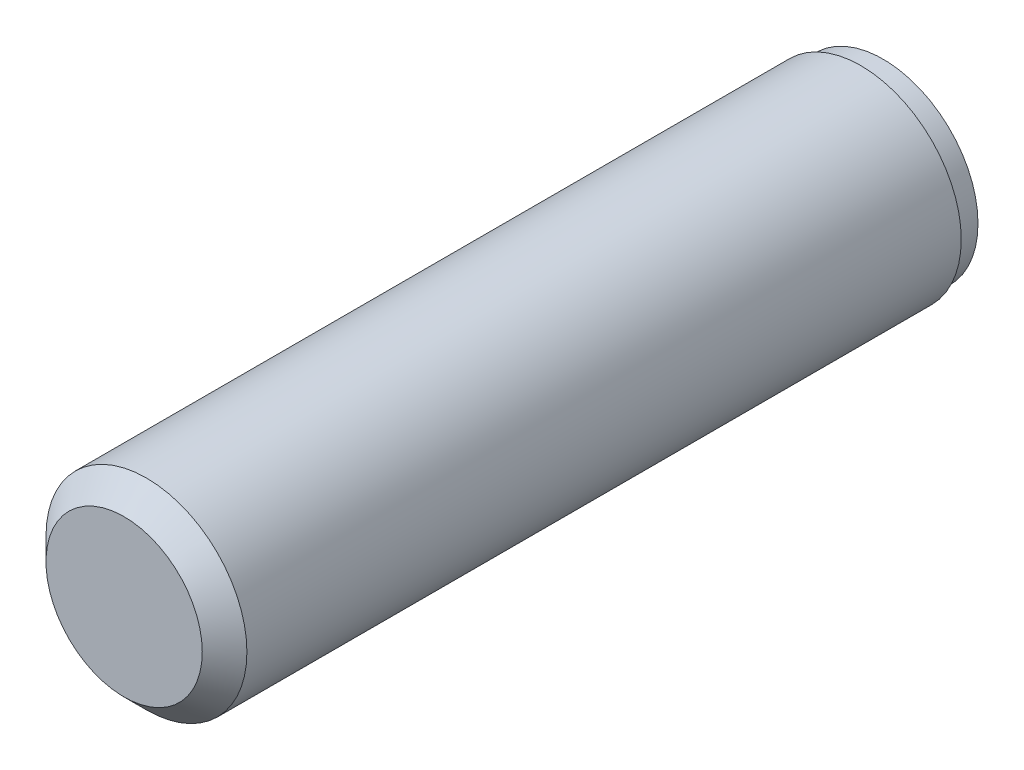
ISO-10303-21;
HEADER;
FILE_DESCRIPTION(('STEP AP214'),'2;1');
FILE_NAME('part.step','',(''),(''),'','','');
FILE_SCHEMA(('AUTOMOTIVE_DESIGN { 1 0 10303 214 1 1 1 1 }'));
ENDSEC;
DATA;
#1=APPLICATION_CONTEXT('core data for automotive mechanical design processes');
#2=APPLICATION_PROTOCOL_DEFINITION('international standard','automotive_design',2000,#1);
#3=PRODUCT_CONTEXT('',#1,'mechanical');
#4=PRODUCT('Part','Part','',(#3));
#5=PRODUCT_RELATED_PRODUCT_CATEGORY('part','',(#4));
#6=PRODUCT_DEFINITION_FORMATION('','',#4);
#7=PRODUCT_DEFINITION_CONTEXT('part definition',#1,'design');
#8=PRODUCT_DEFINITION('design','',#6,#7);
#9=PRODUCT_DEFINITION_SHAPE('','',#8);
#10=(LENGTH_UNIT() NAMED_UNIT(*) SI_UNIT(.MILLI.,.METRE.));
#11=(NAMED_UNIT(*) PLANE_ANGLE_UNIT() SI_UNIT($,.RADIAN.));
#12=(NAMED_UNIT(*) SI_UNIT($,.STERADIAN.) SOLID_ANGLE_UNIT());
#13=UNCERTAINTY_MEASURE_WITH_UNIT(LENGTH_MEASURE(1.E-05),#10,'distance_accuracy_value','');
#14=(GEOMETRIC_REPRESENTATION_CONTEXT(3) GLOBAL_UNCERTAINTY_ASSIGNED_CONTEXT((#13)) GLOBAL_UNIT_ASSIGNED_CONTEXT((#10,
#11,#12)) REPRESENTATION_CONTEXT('',''));
#15=CARTESIAN_POINT('',(0.,0.,0.));
#16=DIRECTION('',(0.,0.,1.));
#17=DIRECTION('',(1.,0.,0.));
#18=AXIS2_PLACEMENT_3D('',#15,#16,#17);
#19=CARTESIAN_POINT('',(0.,0.,66.));
#20=DIRECTION('',(0.,0.,-1.));
#21=DIRECTION('',(-1.,0.,0.));
#22=AXIS2_PLACEMENT_3D('',#19,#20,#21);
#23=CYLINDRICAL_SURFACE('',#22,9.);
#24=CARTESIAN_POINT('',(0.,0.,64.));
#25=DIRECTION('',(0.,0.,1.));
#26=DIRECTION('',(1.,0.,0.));
#27=AXIS2_PLACEMENT_3D('',#24,#25,#26);
#28=CIRCLE('',#27,9.);
#29=CARTESIAN_POINT('',(9.,0.,64.));
#30=VERTEX_POINT('',#29);
#31=EDGE_CURVE('E10',#30,#30,#28,.F.);
#32=ORIENTED_EDGE('',*,*,#31,.T.);
#33=EDGE_LOOP('',(#32));
#34=FACE_BOUND('',#33,.T.);
#35=CARTESIAN_POINT('',(0.,0.,0.));
#36=DIRECTION('',(0.,0.,1.));
#37=DIRECTION('',(1.,0.,0.));
#38=AXIS2_PLACEMENT_3D('',#35,#36,#37);
#39=CIRCLE('',#38,9.);
#40=CARTESIAN_POINT('',(9.,0.,0.));
#41=VERTEX_POINT('',#40);
#42=EDGE_CURVE('E70',#41,#41,#39,.T.);
#43=ORIENTED_EDGE('',*,*,#42,.T.);
#44=EDGE_LOOP('',(#43));
#45=FACE_BOUND('',#44,.T.);
#46=ADVANCED_FACE('F44',(#34,#45),#23,.T.);
#47=CARTESIAN_POINT('',(0.,0.,66.));
#48=DIRECTION('',(0.,0.,1.));
#49=DIRECTION('',(1.,0.,0.));
#50=AXIS2_PLACEMENT_3D('',#47,#48,#49);
#51=PLANE('',#50);
#52=CARTESIAN_POINT('',(0.,0.,66.));
#53=DIRECTION('',(0.,0.,1.));
#54=DIRECTION('',(1.,0.,0.));
#55=AXIS2_PLACEMENT_3D('',#52,#53,#54);
#56=CIRCLE('',#55,6.99999999999999);
#57=CARTESIAN_POINT('',(6.99999999999999,0.,66.));
#58=VERTEX_POINT('',#57);
#59=EDGE_CURVE('E53',#58,#58,#56,.T.);
#60=ORIENTED_EDGE('',*,*,#59,.T.);
#61=EDGE_LOOP('',(#60));
#62=FACE_BOUND('',#61,.T.);
#63=ADVANCED_FACE('F131',(#62),#51,.T.);
#64=CARTESIAN_POINT('',(0.,0.,0.));
#65=DIRECTION('',(0.,0.,1.));
#66=DIRECTION('',(1.,0.,0.));
#67=AXIS2_PLACEMENT_3D('',#64,#65,#66);
#68=PLANE('',#67);
#69=CARTESIAN_POINT('',(0.,0.,0.));
#70=DIRECTION('',(0.,0.,-1.));
#71=DIRECTION('',(-1.,0.,0.));
#72=AXIS2_PLACEMENT_3D('',#69,#70,#71);
#73=CIRCLE('',#72,8.5);
#74=CARTESIAN_POINT('',(-8.5,0.,0.));
#75=VERTEX_POINT('',#74);
#76=EDGE_CURVE('E69',#75,#75,#73,.T.);
#77=ORIENTED_EDGE('',*,*,#76,.F.);
#78=EDGE_LOOP('',(#77));
#79=FACE_BOUND('',#78,.T.);
#80=ORIENTED_EDGE('',*,*,#42,.F.);
#81=EDGE_LOOP('',(#80));
#82=FACE_BOUND('',#81,.T.);
#83=ADVANCED_FACE('F125',(#79,#82),#68,.F.);
#84=CARTESIAN_POINT('',(0.,0.,-2.));
#85=DIRECTION('',(0.,0.,1.));
#86=DIRECTION('',(1.,0.,0.));
#87=AXIS2_PLACEMENT_3D('',#84,#85,#86);
#88=CYLINDRICAL_SURFACE('',#87,8.5);
#89=CARTESIAN_POINT('',(0.,0.,-2.));
#90=DIRECTION('',(0.,0.,-1.));
#91=DIRECTION('',(-1.,0.,0.));
#92=AXIS2_PLACEMENT_3D('',#89,#90,#91);
#93=CIRCLE('',#92,8.5);
#94=CARTESIAN_POINT('',(-8.5,0.,-2.));
#95=VERTEX_POINT('',#94);
#96=EDGE_CURVE('E74',#95,#95,#93,.T.);
#97=ORIENTED_EDGE('',*,*,#96,.F.);
#98=EDGE_LOOP('',(#97));
#99=FACE_BOUND('',#98,.T.);
#100=ORIENTED_EDGE('',*,*,#76,.T.);
#101=EDGE_LOOP('',(#100));
#102=FACE_BOUND('',#101,.T.);
#103=ADVANCED_FACE('F119',(#99,#102),#88,.T.);
#104=CARTESIAN_POINT('',(0.,0.,-2.));
#105=DIRECTION('',(0.,0.,-1.));
#106=DIRECTION('',(-1.,0.,0.));
#107=AXIS2_PLACEMENT_3D('',#104,#105,#106);
#108=PLANE('',#107);
#109=CARTESIAN_POINT('',(0.,0.,-2.));
#110=DIRECTION('',(0.,0.,-1.));
#111=DIRECTION('',(-1.,0.,0.));
#112=AXIS2_PLACEMENT_3D('',#109,#110,#111);
#113=CIRCLE('',#112,8.);
#114=CARTESIAN_POINT('',(-8.,0.,-2.));
#115=VERTEX_POINT('',#114);
#116=EDGE_CURVE('E82',#115,#115,#113,.T.);
#117=ORIENTED_EDGE('',*,*,#116,.F.);
#118=EDGE_LOOP('',(#117));
#119=FACE_BOUND('',#118,.T.);
#120=ORIENTED_EDGE('',*,*,#96,.T.);
#121=EDGE_LOOP('',(#120));
#122=FACE_BOUND('',#121,.T.);
#123=ADVANCED_FACE('F113',(#119,#122),#108,.T.);
#124=CARTESIAN_POINT('',(0.,0.,-0.5));
#125=DIRECTION('',(0.,0.,-1.));
#126=DIRECTION('',(-1.,0.,0.));
#127=AXIS2_PLACEMENT_3D('',#124,#125,#126);
#128=CYLINDRICAL_SURFACE('',#127,8.);
#129=CARTESIAN_POINT('',(0.,0.,-0.5));
#130=DIRECTION('',(0.,0.,-1.));
#131=DIRECTION('',(-1.,0.,0.));
#132=AXIS2_PLACEMENT_3D('',#129,#130,#131);
#133=CIRCLE('',#132,8.);
#134=CARTESIAN_POINT('',(-8.,0.,-0.5));
#135=VERTEX_POINT('',#134);
#136=EDGE_CURVE('E81',#135,#135,#133,.T.);
#137=ORIENTED_EDGE('',*,*,#136,.F.);
#138=EDGE_LOOP('',(#137));
#139=FACE_BOUND('',#138,.T.);
#140=ORIENTED_EDGE('',*,*,#116,.T.);
#141=EDGE_LOOP('',(#140));
#142=FACE_BOUND('',#141,.T.);
#143=ADVANCED_FACE('F105',(#139,#142),#128,.F.);
#144=CARTESIAN_POINT('',(0.,0.,-0.5));
#145=DIRECTION('',(0.,0.,-1.));
#146=DIRECTION('',(-1.,0.,0.));
#147=AXIS2_PLACEMENT_3D('',#144,#145,#146);
#148=PLANE('',#147);
#149=CARTESIAN_POINT('',(0.,-4.,-0.5));
#150=DIRECTION('',(0.,0.,-1.));
#151=DIRECTION('',(-1.,0.,0.));
#152=AXIS2_PLACEMENT_3D('',#149,#150,#151);
#153=CIRCLE('',#152,3.);
#154=CARTESIAN_POINT('',(-3.,-4.,-0.5));
#155=VERTEX_POINT('',#154);
#156=EDGE_CURVE('E93',#155,#155,#153,.T.);
#157=ORIENTED_EDGE('',*,*,#156,.F.);
#158=EDGE_LOOP('',(#157));
#159=FACE_BOUND('',#158,.T.);
#160=CARTESIAN_POINT('',(0.,4.,-0.5));
#161=DIRECTION('',(0.,0.,-1.));
#162=DIRECTION('',(-1.,0.,0.));
#163=AXIS2_PLACEMENT_3D('',#160,#161,#162);
#164=CIRCLE('',#163,3.);
#165=CARTESIAN_POINT('',(-3.,4.,-0.5));
#166=VERTEX_POINT('',#165);
#167=EDGE_CURVE('E86',#166,#166,#164,.T.);
#168=ORIENTED_EDGE('',*,*,#167,.F.);
#169=EDGE_LOOP('',(#168));
#170=FACE_BOUND('',#169,.T.);
#171=ORIENTED_EDGE('',*,*,#136,.T.);
#172=EDGE_LOOP('',(#171));
#173=FACE_BOUND('',#172,.T.);
#174=ADVANCED_FACE('F101',(#159,#170,#173),#148,.T.);
#175=CARTESIAN_POINT('',(0.,4.,-1.5));
#176=DIRECTION('',(0.,0.,-1.));
#177=DIRECTION('',(-1.,0.,0.));
#178=AXIS2_PLACEMENT_3D('',#175,#176,#177);
#179=PLANE('',#178);
#180=CARTESIAN_POINT('',(0.,4.,-1.5));
#181=DIRECTION('',(0.,0.,-1.));
#182=DIRECTION('',(-1.,0.,0.));
#183=AXIS2_PLACEMENT_3D('',#180,#181,#182);
#184=CIRCLE('',#183,2.);
#185=CARTESIAN_POINT('',(-2.,4.,-1.5));
#186=VERTEX_POINT('',#185);
#187=EDGE_CURVE('E58',#186,#186,#184,.T.);
#188=ORIENTED_EDGE('',*,*,#187,.T.);
#189=EDGE_LOOP('',(#188));
#190=FACE_BOUND('',#189,.T.);
#191=ADVANCED_FACE('F104',(#190),#179,.T.);
#192=CARTESIAN_POINT('',(0.,-4.,-1.5));
#193=DIRECTION('',(0.,0.,-1.));
#194=DIRECTION('',(-1.,0.,0.));
#195=AXIS2_PLACEMENT_3D('',#192,#193,#194);
#196=PLANE('',#195);
#197=CARTESIAN_POINT('',(0.,-4.,-1.5));
#198=DIRECTION('',(0.,0.,-1.));
#199=DIRECTION('',(-1.,0.,0.));
#200=AXIS2_PLACEMENT_3D('',#197,#198,#199);
#201=CIRCLE('',#200,2.);
#202=CARTESIAN_POINT('',(-2.,-4.,-1.5));
#203=VERTEX_POINT('',#202);
#204=EDGE_CURVE('E63',#203,#203,#201,.T.);
#205=ORIENTED_EDGE('',*,*,#204,.T.);
#206=EDGE_LOOP('',(#205));
#207=FACE_BOUND('',#206,.T.);
#208=ADVANCED_FACE('F145',(#207),#196,.T.);
#209=CARTESIAN_POINT('',(0.,-4.,-0.5));
#210=DIRECTION('',(0.,0.,-1.));
#211=DIRECTION('',(-1.,0.,0.));
#212=AXIS2_PLACEMENT_3D('',#209,#210,#211);
#213=TOROIDAL_SURFACE('',#212,2.,1.);
#214=ORIENTED_EDGE('',*,*,#156,.T.);
#215=EDGE_LOOP('',(#214));
#216=FACE_BOUND('',#215,.T.);
#217=ORIENTED_EDGE('',*,*,#204,.F.);
#218=EDGE_LOOP('',(#217));
#219=FACE_BOUND('',#218,.T.);
#220=ADVANCED_FACE('F98',(#216,#219),#213,.T.);
#221=CARTESIAN_POINT('',(0.,4.,-0.5));
#222=DIRECTION('',(0.,0.,-1.));
#223=DIRECTION('',(-1.,0.,0.));
#224=AXIS2_PLACEMENT_3D('',#221,#222,#223);
#225=TOROIDAL_SURFACE('',#224,2.,1.);
#226=ORIENTED_EDGE('',*,*,#167,.T.);
#227=EDGE_LOOP('',(#226));
#228=FACE_BOUND('',#227,.T.);
#229=ORIENTED_EDGE('',*,*,#187,.F.);
#230=EDGE_LOOP('',(#229));
#231=FACE_BOUND('',#230,.T.);
#232=ADVANCED_FACE('F144',(#228,#231),#225,.T.);
#233=CARTESIAN_POINT('',(0.,0.,66.));
#234=DIRECTION('',(0.,0.,-1.));
#235=DIRECTION('',(-1.,0.,0.));
#236=AXIS2_PLACEMENT_3D('',#233,#234,#235);
#237=CONICAL_SURFACE('',#236,6.99999999999999,0.785398163397446);
#238=ORIENTED_EDGE('',*,*,#31,.F.);
#239=EDGE_LOOP('',(#238));
#240=FACE_BOUND('',#239,.T.);
#241=ORIENTED_EDGE('',*,*,#59,.F.);
#242=EDGE_LOOP('',(#241));
#243=FACE_BOUND('',#242,.T.);
#244=ADVANCED_FACE('F47',(#240,#243),#237,.T.);
#245=CLOSED_SHELL('',(#46,#63,#83,#103,#123,#143,#174,#191,#208,#220,#232,#244));
#246=MANIFOLD_SOLID_BREP('B2',#245);
#247=ADVANCED_BREP_SHAPE_REPRESENTATION('',(#18,#246),#14);
#248=SHAPE_DEFINITION_REPRESENTATION(#9,#247);
ENDSEC;
END-ISO-10303-21;
